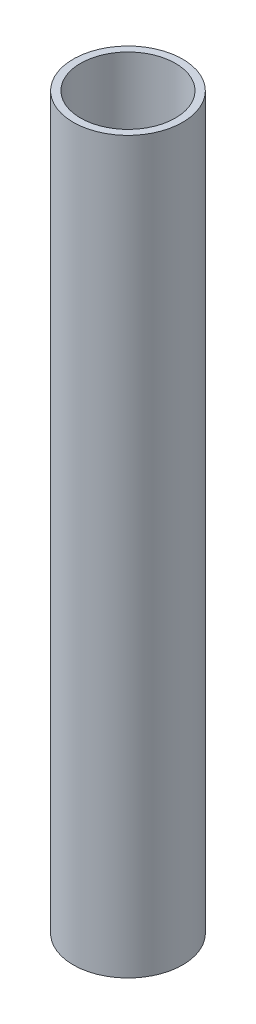
ISO-10303-21;
HEADER;
FILE_DESCRIPTION(('STEP AP214'),'2;1');
FILE_NAME('part.step','',(''),(''),'','','');
FILE_SCHEMA(('AUTOMOTIVE_DESIGN { 1 0 10303 214 1 1 1 1 }'));
ENDSEC;
DATA;
#1=APPLICATION_CONTEXT('core data for automotive mechanical design processes');
#2=APPLICATION_PROTOCOL_DEFINITION('international standard','automotive_design',2000,#1);
#3=PRODUCT_CONTEXT('',#1,'mechanical');
#4=PRODUCT('Part','Part','',(#3));
#5=PRODUCT_RELATED_PRODUCT_CATEGORY('part','',(#4));
#6=PRODUCT_DEFINITION_FORMATION('','',#4);
#7=PRODUCT_DEFINITION_CONTEXT('part definition',#1,'design');
#8=PRODUCT_DEFINITION('design','',#6,#7);
#9=PRODUCT_DEFINITION_SHAPE('','',#8);
#10=(LENGTH_UNIT() NAMED_UNIT(*) SI_UNIT(.MILLI.,.METRE.));
#11=(NAMED_UNIT(*) PLANE_ANGLE_UNIT() SI_UNIT($,.RADIAN.));
#12=(NAMED_UNIT(*) SI_UNIT($,.STERADIAN.) SOLID_ANGLE_UNIT());
#13=UNCERTAINTY_MEASURE_WITH_UNIT(LENGTH_MEASURE(1.E-05),#10,'distance_accuracy_value','');
#14=(GEOMETRIC_REPRESENTATION_CONTEXT(3) GLOBAL_UNCERTAINTY_ASSIGNED_CONTEXT((#13)) GLOBAL_UNIT_ASSIGNED_CONTEXT((#10,
#11,#12)) REPRESENTATION_CONTEXT('',''));
#15=CARTESIAN_POINT('',(0.,0.,0.));
#16=DIRECTION('',(0.,0.,1.));
#17=DIRECTION('',(1.,0.,0.));
#18=AXIS2_PLACEMENT_3D('',#15,#16,#17);
#19=CARTESIAN_POINT('',(0.,100.,0.));
#20=DIRECTION('',(0.,1.,0.));
#21=DIRECTION('',(0.,0.,1.));
#22=AXIS2_PLACEMENT_3D('',#19,#20,#21);
#23=PLANE('',#22);
#24=CARTESIAN_POINT('',(0.,100.,0.));
#25=DIRECTION('',(0.,1.,0.));
#26=DIRECTION('',(0.,0.,1.));
#27=AXIS2_PLACEMENT_3D('',#24,#25,#26);
#28=CIRCLE('',#27,7.5);
#29=CARTESIAN_POINT('',(0.,100.,7.5));
#30=VERTEX_POINT('',#29);
#31=EDGE_CURVE('E11',#30,#30,#28,.T.);
#32=ORIENTED_EDGE('',*,*,#31,.T.);
#33=EDGE_LOOP('',(#32));
#34=FACE_BOUND('',#33,.T.);
#35=CARTESIAN_POINT('',(0.,100.,0.));
#36=DIRECTION('',(0.,1.,0.));
#37=DIRECTION('',(1.,0.,0.));
#38=AXIS2_PLACEMENT_3D('',#35,#36,#37);
#39=CIRCLE('',#38,6.5);
#40=CARTESIAN_POINT('',(6.5,100.,0.));
#41=VERTEX_POINT('',#40);
#42=EDGE_CURVE('E56',#41,#41,#39,.T.);
#43=ORIENTED_EDGE('',*,*,#42,.F.);
#44=EDGE_LOOP('',(#43));
#45=FACE_BOUND('',#44,.T.);
#46=ADVANCED_FACE('F43',(#34,#45),#23,.T.);
#47=CARTESIAN_POINT('',(0.,0.,0.));
#48=DIRECTION('',(0.,1.,0.));
#49=DIRECTION('',(0.,0.,1.));
#50=AXIS2_PLACEMENT_3D('',#47,#48,#49);
#51=PLANE('',#50);
#52=CARTESIAN_POINT('',(0.,0.,0.));
#53=DIRECTION('',(0.,1.,0.));
#54=DIRECTION('',(0.,0.,1.));
#55=AXIS2_PLACEMENT_3D('',#52,#53,#54);
#56=CIRCLE('',#55,7.5);
#57=CARTESIAN_POINT('',(0.,0.,7.5));
#58=VERTEX_POINT('',#57);
#59=EDGE_CURVE('E47',#58,#58,#56,.T.);
#60=ORIENTED_EDGE('',*,*,#59,.F.);
#61=EDGE_LOOP('',(#60));
#62=FACE_BOUND('',#61,.T.);
#63=CARTESIAN_POINT('',(0.,0.,0.));
#64=DIRECTION('',(0.,1.,0.));
#65=DIRECTION('',(1.,0.,0.));
#66=AXIS2_PLACEMENT_3D('',#63,#64,#65);
#67=CIRCLE('',#66,6.5);
#68=CARTESIAN_POINT('',(6.5,0.,0.));
#69=VERTEX_POINT('',#68);
#70=EDGE_CURVE('E58',#69,#69,#67,.T.);
#71=ORIENTED_EDGE('',*,*,#70,.T.);
#72=EDGE_LOOP('',(#71));
#73=FACE_BOUND('',#72,.T.);
#74=ADVANCED_FACE('F70',(#62,#73),#51,.F.);
#75=CARTESIAN_POINT('',(0.,100.,0.));
#76=DIRECTION('',(0.,-1.,0.));
#77=DIRECTION('',(0.,0.,-1.));
#78=AXIS2_PLACEMENT_3D('',#75,#76,#77);
#79=CYLINDRICAL_SURFACE('',#78,7.5);
#80=ORIENTED_EDGE('',*,*,#31,.F.);
#81=EDGE_LOOP('',(#80));
#82=FACE_BOUND('',#81,.T.);
#83=ORIENTED_EDGE('',*,*,#59,.T.);
#84=EDGE_LOOP('',(#83));
#85=FACE_BOUND('',#84,.T.);
#86=ADVANCED_FACE('F45',(#82,#85),#79,.T.);
#87=CARTESIAN_POINT('',(0.,100.,0.));
#88=DIRECTION('',(0.,-1.,0.));
#89=DIRECTION('',(0.,0.,-1.));
#90=AXIS2_PLACEMENT_3D('',#87,#88,#89);
#91=CYLINDRICAL_SURFACE('',#90,6.5);
#92=ORIENTED_EDGE('',*,*,#42,.T.);
#93=EDGE_LOOP('',(#92));
#94=FACE_BOUND('',#93,.T.);
#95=ORIENTED_EDGE('',*,*,#70,.F.);
#96=EDGE_LOOP('',(#95));
#97=FACE_BOUND('',#96,.T.);
#98=ADVANCED_FACE('F66',(#94,#97),#91,.F.);
#99=CLOSED_SHELL('',(#46,#74,#86,#98));
#100=MANIFOLD_SOLID_BREP('B2',#99);
#101=ADVANCED_BREP_SHAPE_REPRESENTATION('',(#18,#100),#14);
#102=SHAPE_DEFINITION_REPRESENTATION(#9,#101);
ENDSEC;
END-ISO-10303-21;
